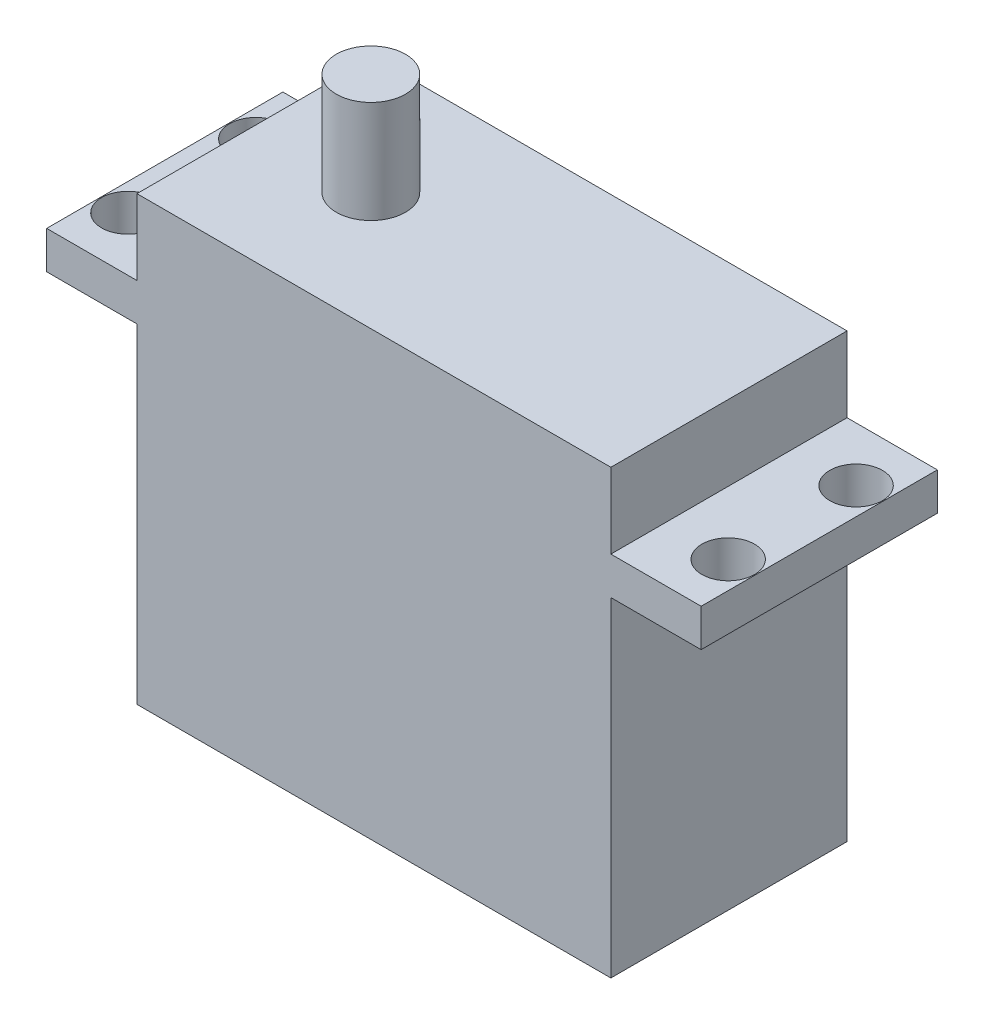
ISO-10303-21;
HEADER;
FILE_DESCRIPTION(('STEP AP214'),'2;1');
FILE_NAME('part.step','',(''),(''),'','','');
FILE_SCHEMA(('AUTOMOTIVE_DESIGN { 1 0 10303 214 1 1 1 1 }'));
ENDSEC;
DATA;
#1=APPLICATION_CONTEXT('core data for automotive mechanical design processes');
#2=APPLICATION_PROTOCOL_DEFINITION('international standard','automotive_design',2000,#1);
#3=PRODUCT_CONTEXT('',#1,'mechanical');
#4=PRODUCT('Part','Part','',(#3));
#5=PRODUCT_RELATED_PRODUCT_CATEGORY('part','',(#4));
#6=PRODUCT_DEFINITION_FORMATION('','',#4);
#7=PRODUCT_DEFINITION_CONTEXT('part definition',#1,'design');
#8=PRODUCT_DEFINITION('design','',#6,#7);
#9=PRODUCT_DEFINITION_SHAPE('','',#8);
#10=(LENGTH_UNIT() NAMED_UNIT(*) SI_UNIT(.MILLI.,.METRE.));
#11=(NAMED_UNIT(*) PLANE_ANGLE_UNIT() SI_UNIT($,.RADIAN.));
#12=(NAMED_UNIT(*) SI_UNIT($,.STERADIAN.) SOLID_ANGLE_UNIT());
#13=UNCERTAINTY_MEASURE_WITH_UNIT(LENGTH_MEASURE(1.E-05),#10,'distance_accuracy_value','');
#14=(GEOMETRIC_REPRESENTATION_CONTEXT(3) GLOBAL_UNCERTAINTY_ASSIGNED_CONTEXT((#13)) GLOBAL_UNIT_ASSIGNED_CONTEXT((#10,
#11,#12)) REPRESENTATION_CONTEXT('',''));
#15=CARTESIAN_POINT('',(0.,0.,0.));
#16=DIRECTION('',(0.,0.,1.));
#17=DIRECTION('',(1.,0.,0.));
#18=AXIS2_PLACEMENT_3D('',#15,#16,#17);
#19=CARTESIAN_POINT('',(0.,37.338,0.));
#20=DIRECTION('',(1.,0.,0.));
#21=DIRECTION('',(0.,0.,-1.));
#22=AXIS2_PLACEMENT_3D('',#19,#20,#21);
#23=PLANE('',#22);
#24=DIRECTION('',(0.,-1.,0.));
#25=VECTOR('',#24,1.);
#26=CARTESIAN_POINT('',(0.,37.338,0.));
#27=LINE('',#26,#25);
#28=CARTESIAN_POINT('',(0.,27.813,0.));
#29=VERTEX_POINT('',#28);
#30=CARTESIAN_POINT('',(0.,0.,0.));
#31=VERTEX_POINT('',#30);
#32=EDGE_CURVE('E272',#29,#31,#27,.T.);
#33=ORIENTED_EDGE('',*,*,#32,.F.);
#34=DIRECTION('',(0.,0.,-1.));
#35=VECTOR('',#34,1.);
#36=CARTESIAN_POINT('',(0.,27.813,0.));
#37=LINE('',#36,#35);
#38=CARTESIAN_POINT('',(0.,27.813,-19.939));
#39=VERTEX_POINT('',#38);
#40=EDGE_CURVE('E153',#29,#39,#37,.T.);
#41=ORIENTED_EDGE('',*,*,#40,.T.);
#42=DIRECTION('',(0.,-1.,0.));
#43=VECTOR('',#42,1.);
#44=CARTESIAN_POINT('',(0.,37.338,-19.939));
#45=LINE('',#44,#43);
#46=CARTESIAN_POINT('',(0.,0.,-19.939));
#47=VERTEX_POINT('',#46);
#48=EDGE_CURVE('E245',#39,#47,#45,.T.);
#49=ORIENTED_EDGE('',*,*,#48,.T.);
#50=DIRECTION('',(0.,0.,1.));
#51=VECTOR('',#50,1.);
#52=CARTESIAN_POINT('',(0.,0.,0.));
#53=LINE('',#52,#51);
#54=EDGE_CURVE('E230',#47,#31,#53,.T.);
#55=ORIENTED_EDGE('',*,*,#54,.T.);
#56=EDGE_LOOP('',(#33,#41,#49,#55));
#57=FACE_BOUND('',#56,.T.);
#58=ADVANCED_FACE('F43',(#57),#23,.F.);
#59=CARTESIAN_POINT('',(40.005,37.338,0.));
#60=DIRECTION('',(-1.,0.,0.));
#61=DIRECTION('',(0.,0.,1.));
#62=AXIS2_PLACEMENT_3D('',#59,#60,#61);
#63=PLANE('',#62);
#64=DIRECTION('',(0.,0.,1.));
#65=VECTOR('',#64,1.);
#66=CARTESIAN_POINT('',(40.005,30.988,0.));
#67=LINE('',#66,#65);
#68=CARTESIAN_POINT('',(40.005,30.988,-19.939));
#69=VERTEX_POINT('',#68);
#70=CARTESIAN_POINT('',(40.005,30.988,0.));
#71=VERTEX_POINT('',#70);
#72=EDGE_CURVE('E200',#69,#71,#67,.T.);
#73=ORIENTED_EDGE('',*,*,#72,.F.);
#74=DIRECTION('',(0.,-1.,0.));
#75=VECTOR('',#74,1.);
#76=CARTESIAN_POINT('',(40.005,37.338,-19.939));
#77=LINE('',#76,#75);
#78=CARTESIAN_POINT('',(40.005,37.338,-19.939));
#79=VERTEX_POINT('',#78);
#80=EDGE_CURVE('E264',#79,#69,#77,.T.);
#81=ORIENTED_EDGE('',*,*,#80,.F.);
#82=DIRECTION('',(0.,0.,-1.));
#83=VECTOR('',#82,1.);
#84=CARTESIAN_POINT('',(40.005,37.338,0.));
#85=LINE('',#84,#83);
#86=CARTESIAN_POINT('',(40.005,37.338,0.));
#87=VERTEX_POINT('',#86);
#88=EDGE_CURVE('E239',#87,#79,#85,.T.);
#89=ORIENTED_EDGE('',*,*,#88,.F.);
#90=DIRECTION('',(0.,-1.,0.));
#91=VECTOR('',#90,1.);
#92=CARTESIAN_POINT('',(40.005,37.338,0.));
#93=LINE('',#92,#91);
#94=EDGE_CURVE('E269',#87,#71,#93,.T.);
#95=ORIENTED_EDGE('',*,*,#94,.T.);
#96=EDGE_LOOP('',(#73,#81,#89,#95));
#97=FACE_BOUND('',#96,.T.);
#98=ADVANCED_FACE('F356',(#97),#63,.F.);
#99=DIRECTION('',(0.,0.,-1.));
#100=VECTOR('',#99,1.);
#101=CARTESIAN_POINT('',(40.005,27.813,0.));
#102=LINE('',#101,#100);
#103=CARTESIAN_POINT('',(40.005,27.813,0.));
#104=VERTEX_POINT('',#103);
#105=CARTESIAN_POINT('',(40.005,27.813,-19.939));
#106=VERTEX_POINT('',#105);
#107=EDGE_CURVE('E67',#104,#106,#102,.T.);
#108=ORIENTED_EDGE('',*,*,#107,.F.);
#109=CARTESIAN_POINT('',(40.005,0.,0.));
#110=VERTEX_POINT('',#109);
#111=EDGE_CURVE('E268',#104,#110,#93,.T.);
#112=ORIENTED_EDGE('',*,*,#111,.T.);
#113=DIRECTION('',(0.,0.,-1.));
#114=VECTOR('',#113,1.);
#115=CARTESIAN_POINT('',(40.005,0.,0.));
#116=LINE('',#115,#114);
#117=CARTESIAN_POINT('',(40.005,0.,-19.939));
#118=VERTEX_POINT('',#117);
#119=EDGE_CURVE('E252',#110,#118,#116,.T.);
#120=ORIENTED_EDGE('',*,*,#119,.T.);
#121=EDGE_CURVE('E263',#106,#118,#77,.T.);
#122=ORIENTED_EDGE('',*,*,#121,.F.);
#123=EDGE_LOOP('',(#108,#112,#120,#122));
#124=FACE_BOUND('',#123,.T.);
#125=ADVANCED_FACE('F340',(#124),#63,.F.);
#126=CARTESIAN_POINT('',(0.,37.338,-19.939));
#127=VERTEX_POINT('',#126);
#128=CARTESIAN_POINT('',(0.,30.988,-19.939));
#129=VERTEX_POINT('',#128);
#130=EDGE_CURVE('E259',#127,#129,#45,.T.);
#131=ORIENTED_EDGE('',*,*,#130,.T.);
#132=DIRECTION('',(0.,0.,1.));
#133=VECTOR('',#132,1.);
#134=CARTESIAN_POINT('',(0.,30.988,0.));
#135=LINE('',#134,#133);
#136=CARTESIAN_POINT('',(0.,30.988,0.));
#137=VERTEX_POINT('',#136);
#138=EDGE_CURVE('E166',#129,#137,#135,.T.);
#139=ORIENTED_EDGE('',*,*,#138,.T.);
#140=CARTESIAN_POINT('',(0.,37.338,0.));
#141=VERTEX_POINT('',#140);
#142=EDGE_CURVE('E52',#141,#137,#27,.T.);
#143=ORIENTED_EDGE('',*,*,#142,.F.);
#144=DIRECTION('',(0.,0.,1.));
#145=VECTOR('',#144,1.);
#146=CARTESIAN_POINT('',(0.,37.338,0.));
#147=LINE('',#146,#145);
#148=EDGE_CURVE('E231',#127,#141,#147,.T.);
#149=ORIENTED_EDGE('',*,*,#148,.F.);
#150=EDGE_LOOP('',(#131,#139,#143,#149));
#151=FACE_BOUND('',#150,.T.);
#152=ADVANCED_FACE('F45',(#151),#23,.F.);
#153=CARTESIAN_POINT('',(0.,37.338,0.));
#154=DIRECTION('',(0.,0.,-1.));
#155=DIRECTION('',(-1.,0.,0.));
#156=AXIS2_PLACEMENT_3D('',#153,#154,#155);
#157=PLANE('',#156);
#158=DIRECTION('',(1.,0.,0.));
#159=VECTOR('',#158,1.);
#160=CARTESIAN_POINT('',(0.,0.,0.));
#161=LINE('',#160,#159);
#162=EDGE_CURVE('E249',#31,#110,#161,.T.);
#163=ORIENTED_EDGE('',*,*,#162,.T.);
#164=ORIENTED_EDGE('',*,*,#111,.F.);
#165=DIRECTION('',(-1.,0.,0.));
#166=VECTOR('',#165,1.);
#167=CARTESIAN_POINT('',(47.625,27.813,0.));
#168=LINE('',#167,#166);
#169=CARTESIAN_POINT('',(47.625,27.813,0.));
#170=VERTEX_POINT('',#169);
#171=EDGE_CURVE('E226',#170,#104,#168,.T.);
#172=ORIENTED_EDGE('',*,*,#171,.F.);
#173=DIRECTION('',(0.,-1.,0.));
#174=VECTOR('',#173,1.);
#175=CARTESIAN_POINT('',(47.625,30.988,0.));
#176=LINE('',#175,#174);
#177=CARTESIAN_POINT('',(47.625,30.988,0.));
#178=VERTEX_POINT('',#177);
#179=EDGE_CURVE('E195',#178,#170,#176,.T.);
#180=ORIENTED_EDGE('',*,*,#179,.F.);
#181=DIRECTION('',(-1.,0.,0.));
#182=VECTOR('',#181,1.);
#183=CARTESIAN_POINT('',(47.625,30.988,0.));
#184=LINE('',#183,#182);
#185=EDGE_CURVE('E209',#178,#71,#184,.T.);
#186=ORIENTED_EDGE('',*,*,#185,.T.);
#187=ORIENTED_EDGE('',*,*,#94,.F.);
#188=DIRECTION('',(1.,0.,0.));
#189=VECTOR('',#188,1.);
#190=CARTESIAN_POINT('',(0.,37.338,0.));
#191=LINE('',#190,#189);
#192=EDGE_CURVE('E235',#141,#87,#191,.T.);
#193=ORIENTED_EDGE('',*,*,#192,.F.);
#194=ORIENTED_EDGE('',*,*,#142,.T.);
#195=DIRECTION('',(1.,0.,0.));
#196=VECTOR('',#195,1.);
#197=CARTESIAN_POINT('',(-7.62,30.988,0.));
#198=LINE('',#197,#196);
#199=CARTESIAN_POINT('',(-7.62,30.988,0.));
#200=VERTEX_POINT('',#199);
#201=EDGE_CURVE('E59',#200,#137,#198,.T.);
#202=ORIENTED_EDGE('',*,*,#201,.F.);
#203=DIRECTION('',(0.,-1.,0.));
#204=VECTOR('',#203,1.);
#205=CARTESIAN_POINT('',(-7.62,30.988,0.));
#206=LINE('',#205,#204);
#207=CARTESIAN_POINT('',(-7.62,27.813,0.));
#208=VERTEX_POINT('',#207);
#209=EDGE_CURVE('E137',#200,#208,#206,.T.);
#210=ORIENTED_EDGE('',*,*,#209,.T.);
#211=DIRECTION('',(1.,0.,0.));
#212=VECTOR('',#211,1.);
#213=CARTESIAN_POINT('',(-7.62,27.813,0.));
#214=LINE('',#213,#212);
#215=EDGE_CURVE('E165',#208,#29,#214,.T.);
#216=ORIENTED_EDGE('',*,*,#215,.T.);
#217=ORIENTED_EDGE('',*,*,#32,.T.);
#218=EDGE_LOOP('',(#163,#164,#172,#180,#186,#187,#193,#194,#202,#210,#216,#217));
#219=FACE_BOUND('',#218,.T.);
#220=ADVANCED_FACE('F136',(#219),#157,.F.);
#221=CARTESIAN_POINT('',(0.,37.338,-19.939));
#222=DIRECTION('',(0.,0.,1.));
#223=DIRECTION('',(1.,0.,0.));
#224=AXIS2_PLACEMENT_3D('',#221,#222,#223);
#225=PLANE('',#224);
#226=DIRECTION('',(-1.,0.,0.));
#227=VECTOR('',#226,1.);
#228=CARTESIAN_POINT('',(0.,0.,-19.939));
#229=LINE('',#228,#227);
#230=EDGE_CURVE('E236',#118,#47,#229,.T.);
#231=ORIENTED_EDGE('',*,*,#230,.T.);
#232=ORIENTED_EDGE('',*,*,#48,.F.);
#233=DIRECTION('',(1.,0.,0.));
#234=VECTOR('',#233,1.);
#235=CARTESIAN_POINT('',(-7.62,27.813,-19.939));
#236=LINE('',#235,#234);
#237=CARTESIAN_POINT('',(-7.62,27.813,-19.939));
#238=VERTEX_POINT('',#237);
#239=EDGE_CURVE('E175',#238,#39,#236,.T.);
#240=ORIENTED_EDGE('',*,*,#239,.F.);
#241=DIRECTION('',(0.,1.,0.));
#242=VECTOR('',#241,1.);
#243=CARTESIAN_POINT('',(-7.62,30.988,-19.939));
#244=LINE('',#243,#242);
#245=CARTESIAN_POINT('',(-7.62,30.988,-19.939));
#246=VERTEX_POINT('',#245);
#247=EDGE_CURVE('E157',#238,#246,#244,.T.);
#248=ORIENTED_EDGE('',*,*,#247,.T.);
#249=DIRECTION('',(1.,0.,0.));
#250=VECTOR('',#249,1.);
#251=CARTESIAN_POINT('',(-7.62,30.988,-19.939));
#252=LINE('',#251,#250);
#253=EDGE_CURVE('E142',#246,#129,#252,.T.);
#254=ORIENTED_EDGE('',*,*,#253,.T.);
#255=ORIENTED_EDGE('',*,*,#130,.F.);
#256=DIRECTION('',(-1.,0.,0.));
#257=VECTOR('',#256,1.);
#258=CARTESIAN_POINT('',(0.,37.338,-19.939));
#259=LINE('',#258,#257);
#260=EDGE_CURVE('E242',#79,#127,#259,.T.);
#261=ORIENTED_EDGE('',*,*,#260,.F.);
#262=ORIENTED_EDGE('',*,*,#80,.T.);
#263=DIRECTION('',(-1.,0.,0.));
#264=VECTOR('',#263,1.);
#265=CARTESIAN_POINT('',(47.625,30.988,-19.939));
#266=LINE('',#265,#264);
#267=CARTESIAN_POINT('',(47.625,30.988,-19.939));
#268=VERTEX_POINT('',#267);
#269=EDGE_CURVE('E218',#268,#69,#266,.T.);
#270=ORIENTED_EDGE('',*,*,#269,.F.);
#271=DIRECTION('',(0.,1.,0.));
#272=VECTOR('',#271,1.);
#273=CARTESIAN_POINT('',(47.625,30.988,-19.939));
#274=LINE('',#273,#272);
#275=CARTESIAN_POINT('',(47.625,27.813,-19.939));
#276=VERTEX_POINT('',#275);
#277=EDGE_CURVE('E203',#276,#268,#274,.T.);
#278=ORIENTED_EDGE('',*,*,#277,.F.);
#279=DIRECTION('',(-1.,0.,0.));
#280=VECTOR('',#279,1.);
#281=CARTESIAN_POINT('',(47.625,27.813,-19.939));
#282=LINE('',#281,#280);
#283=EDGE_CURVE('E222',#276,#106,#282,.T.);
#284=ORIENTED_EDGE('',*,*,#283,.T.);
#285=ORIENTED_EDGE('',*,*,#121,.T.);
#286=EDGE_LOOP('',(#231,#232,#240,#248,#254,#255,#261,#262,#270,#278,#284,#285));
#287=FACE_BOUND('',#286,.T.);
#288=ADVANCED_FACE('F317',(#287),#225,.F.);
#289=CARTESIAN_POINT('',(0.,37.338,0.));
#290=DIRECTION('',(0.,-1.,0.));
#291=DIRECTION('',(0.,0.,-1.));
#292=AXIS2_PLACEMENT_3D('',#289,#290,#291);
#293=PLANE('',#292);
#294=CARTESIAN_POINT('',(9.779,37.338,-9.9695));
#295=DIRECTION('',(0.,-1.,0.));
#296=DIRECTION('',(0.,0.,-1.));
#297=AXIS2_PLACEMENT_3D('',#294,#295,#296);
#298=CIRCLE('',#297,2.921);
#299=CARTESIAN_POINT('',(9.779,37.338,-12.8905));
#300=VERTEX_POINT('',#299);
#301=EDGE_CURVE('E11',#300,#300,#298,.F.);
#302=ORIENTED_EDGE('',*,*,#301,.F.);
#303=EDGE_LOOP('',(#302));
#304=FACE_BOUND('',#303,.T.);
#305=ORIENTED_EDGE('',*,*,#148,.T.);
#306=ORIENTED_EDGE('',*,*,#192,.T.);
#307=ORIENTED_EDGE('',*,*,#88,.T.);
#308=ORIENTED_EDGE('',*,*,#260,.T.);
#309=EDGE_LOOP('',(#305,#306,#307,#308));
#310=FACE_BOUND('',#309,.T.);
#311=ADVANCED_FACE('F313',(#304,#310),#293,.F.);
#312=CARTESIAN_POINT('',(0.,0.,0.));
#313=DIRECTION('',(0.,-1.,0.));
#314=DIRECTION('',(0.,0.,-1.));
#315=AXIS2_PLACEMENT_3D('',#312,#313,#314);
#316=PLANE('',#315);
#317=ORIENTED_EDGE('',*,*,#54,.F.);
#318=ORIENTED_EDGE('',*,*,#230,.F.);
#319=ORIENTED_EDGE('',*,*,#119,.F.);
#320=ORIENTED_EDGE('',*,*,#162,.F.);
#321=EDGE_LOOP('',(#317,#318,#319,#320));
#322=FACE_BOUND('',#321,.T.);
#323=ADVANCED_FACE('F316',(#322),#316,.T.);
#324=CARTESIAN_POINT('',(47.625,27.813,0.));
#325=DIRECTION('',(0.,1.,0.));
#326=DIRECTION('',(0.,0.,1.));
#327=AXIS2_PLACEMENT_3D('',#324,#325,#326);
#328=PLANE('',#327);
#329=CARTESIAN_POINT('',(45.339,27.813,-15.367));
#330=DIRECTION('',(0.,1.,0.));
#331=DIRECTION('',(0.,0.,1.));
#332=AXIS2_PLACEMENT_3D('',#329,#330,#331);
#333=CIRCLE('',#332,2.2225);
#334=CARTESIAN_POINT('',(45.339,27.813,-13.1445));
#335=VERTEX_POINT('',#334);
#336=EDGE_CURVE('E191',#335,#335,#333,.T.);
#337=ORIENTED_EDGE('',*,*,#336,.T.);
#338=EDGE_LOOP('',(#337));
#339=FACE_BOUND('',#338,.T.);
#340=CARTESIAN_POINT('',(45.339,27.813,-4.572));
#341=DIRECTION('',(0.,1.,0.));
#342=DIRECTION('',(0.,0.,1.));
#343=AXIS2_PLACEMENT_3D('',#340,#341,#342);
#344=CIRCLE('',#343,2.2225);
#345=CARTESIAN_POINT('',(45.339,27.813,-2.3495));
#346=VERTEX_POINT('',#345);
#347=EDGE_CURVE('E184',#346,#346,#344,.T.);
#348=ORIENTED_EDGE('',*,*,#347,.T.);
#349=EDGE_LOOP('',(#348));
#350=FACE_BOUND('',#349,.T.);
#351=ORIENTED_EDGE('',*,*,#107,.T.);
#352=ORIENTED_EDGE('',*,*,#283,.F.);
#353=DIRECTION('',(0.,0.,-1.));
#354=VECTOR('',#353,1.);
#355=CARTESIAN_POINT('',(47.625,27.813,0.));
#356=LINE('',#355,#354);
#357=EDGE_CURVE('E199',#170,#276,#356,.T.);
#358=ORIENTED_EDGE('',*,*,#357,.F.);
#359=ORIENTED_EDGE('',*,*,#171,.T.);
#360=EDGE_LOOP('',(#351,#352,#358,#359));
#361=FACE_BOUND('',#360,.T.);
#362=ADVANCED_FACE('F345',(#339,#350,#361),#328,.F.);
#363=CARTESIAN_POINT('',(47.625,30.988,0.));
#364=DIRECTION('',(0.,-1.,0.));
#365=DIRECTION('',(0.,0.,-1.));
#366=AXIS2_PLACEMENT_3D('',#363,#364,#365);
#367=PLANE('',#366);
#368=CARTESIAN_POINT('',(45.339,30.988,-15.367));
#369=DIRECTION('',(0.,1.,0.));
#370=DIRECTION('',(0.,0.,1.));
#371=AXIS2_PLACEMENT_3D('',#368,#369,#370);
#372=CIRCLE('',#371,2.2225);
#373=CARTESIAN_POINT('',(45.339,30.988,-13.1445));
#374=VERTEX_POINT('',#373);
#375=EDGE_CURVE('E180',#374,#374,#372,.T.);
#376=ORIENTED_EDGE('',*,*,#375,.F.);
#377=EDGE_LOOP('',(#376));
#378=FACE_BOUND('',#377,.T.);
#379=CARTESIAN_POINT('',(45.339,30.988,-4.572));
#380=DIRECTION('',(0.,1.,0.));
#381=DIRECTION('',(0.,0.,1.));
#382=AXIS2_PLACEMENT_3D('',#379,#380,#381);
#383=CIRCLE('',#382,2.2225);
#384=CARTESIAN_POINT('',(45.339,30.988,-2.3495));
#385=VERTEX_POINT('',#384);
#386=EDGE_CURVE('E141',#385,#385,#383,.T.);
#387=ORIENTED_EDGE('',*,*,#386,.F.);
#388=EDGE_LOOP('',(#387));
#389=FACE_BOUND('',#388,.T.);
#390=ORIENTED_EDGE('',*,*,#72,.T.);
#391=ORIENTED_EDGE('',*,*,#185,.F.);
#392=DIRECTION('',(0.,0.,1.));
#393=VECTOR('',#392,1.);
#394=CARTESIAN_POINT('',(47.625,30.988,0.));
#395=LINE('',#394,#393);
#396=EDGE_CURVE('E206',#268,#178,#395,.T.);
#397=ORIENTED_EDGE('',*,*,#396,.F.);
#398=ORIENTED_EDGE('',*,*,#269,.T.);
#399=EDGE_LOOP('',(#390,#391,#397,#398));
#400=FACE_BOUND('',#399,.T.);
#401=ADVANCED_FACE('F352',(#378,#389,#400),#367,.F.);
#402=CARTESIAN_POINT('',(47.625,0.,0.));
#403=DIRECTION('',(1.,0.,0.));
#404=DIRECTION('',(0.,0.,-1.));
#405=AXIS2_PLACEMENT_3D('',#402,#403,#404);
#406=PLANE('',#405);
#407=ORIENTED_EDGE('',*,*,#179,.T.);
#408=ORIENTED_EDGE('',*,*,#357,.T.);
#409=ORIENTED_EDGE('',*,*,#277,.T.);
#410=ORIENTED_EDGE('',*,*,#396,.T.);
#411=EDGE_LOOP('',(#407,#408,#409,#410));
#412=FACE_BOUND('',#411,.T.);
#413=ADVANCED_FACE('F347',(#412),#406,.T.);
#414=CARTESIAN_POINT('',(45.339,0.,-4.572));
#415=DIRECTION('',(0.,1.,0.));
#416=DIRECTION('',(0.,0.,1.));
#417=AXIS2_PLACEMENT_3D('',#414,#415,#416);
#418=CYLINDRICAL_SURFACE('',#417,2.2225);
#419=CARTESIAN_POINT('',(45.339,30.988,-2.3495));
#420=CARTESIAN_POINT('',(45.339,30.9549270833333,-2.3495));
#421=CARTESIAN_POINT('',(45.339,30.9218541666667,-2.3495));
#422=CARTESIAN_POINT('',(45.339,30.8557083333333,-2.3495));
#423=CARTESIAN_POINT('',(45.339,30.8226354166667,-2.3495));
#424=CARTESIAN_POINT('',(45.339,30.7564895833333,-2.3495));
#425=CARTESIAN_POINT('',(45.339,30.7234166666667,-2.3495));
#426=CARTESIAN_POINT('',(45.339,30.6572708333333,-2.3495));
#427=CARTESIAN_POINT('',(45.339,30.6241979166667,-2.3495));
#428=CARTESIAN_POINT('',(45.339,30.5580520833333,-2.3495));
#429=CARTESIAN_POINT('',(45.339,30.5249791666667,-2.3495));
#430=CARTESIAN_POINT('',(45.339,30.4588333333333,-2.3495));
#431=CARTESIAN_POINT('',(45.339,30.4257604166667,-2.3495));
#432=CARTESIAN_POINT('',(45.339,30.3596145833333,-2.3495));
#433=CARTESIAN_POINT('',(45.339,30.3265416666667,-2.3495));
#434=CARTESIAN_POINT('',(45.339,30.2603958333333,-2.3495));
#435=CARTESIAN_POINT('',(45.339,30.2273229166667,-2.3495));
#436=CARTESIAN_POINT('',(45.339,30.1611770833333,-2.3495));
#437=CARTESIAN_POINT('',(45.339,30.1281041666667,-2.3495));
#438=CARTESIAN_POINT('',(45.339,30.0619583333333,-2.3495));
#439=CARTESIAN_POINT('',(45.339,30.0288854166667,-2.3495));
#440=CARTESIAN_POINT('',(45.339,29.9627395833333,-2.3495));
#441=CARTESIAN_POINT('',(45.339,29.9296666666667,-2.3495));
#442=CARTESIAN_POINT('',(45.339,29.8635208333333,-2.3495));
#443=CARTESIAN_POINT('',(45.339,29.8304479166667,-2.3495));
#444=CARTESIAN_POINT('',(45.339,29.7643020833333,-2.3495));
#445=CARTESIAN_POINT('',(45.339,29.7312291666667,-2.3495));
#446=CARTESIAN_POINT('',(45.339,29.6650833333333,-2.3495));
#447=CARTESIAN_POINT('',(45.339,29.6320104166667,-2.3495));
#448=CARTESIAN_POINT('',(45.339,29.5658645833333,-2.3495));
#449=CARTESIAN_POINT('',(45.339,29.5327916666667,-2.3495));
#450=CARTESIAN_POINT('',(45.339,29.4666458333333,-2.3495));
#451=CARTESIAN_POINT('',(45.339,29.4335729166667,-2.3495));
#452=CARTESIAN_POINT('',(45.339,29.3674270833333,-2.3495));
#453=CARTESIAN_POINT('',(45.339,29.3343541666667,-2.3495));
#454=CARTESIAN_POINT('',(45.339,29.2682083333333,-2.3495));
#455=CARTESIAN_POINT('',(45.339,29.2351354166667,-2.3495));
#456=CARTESIAN_POINT('',(45.339,29.1689895833333,-2.3495));
#457=CARTESIAN_POINT('',(45.339,29.1359166666667,-2.3495));
#458=CARTESIAN_POINT('',(45.339,29.0697708333333,-2.3495));
#459=CARTESIAN_POINT('',(45.339,29.0366979166667,-2.3495));
#460=CARTESIAN_POINT('',(45.339,28.9705520833333,-2.3495));
#461=CARTESIAN_POINT('',(45.339,28.9374791666667,-2.3495));
#462=CARTESIAN_POINT('',(45.339,28.8713333333333,-2.3495));
#463=CARTESIAN_POINT('',(45.339,28.8382604166667,-2.3495));
#464=CARTESIAN_POINT('',(45.339,28.7721145833333,-2.3495));
#465=CARTESIAN_POINT('',(45.339,28.7390416666667,-2.3495));
#466=CARTESIAN_POINT('',(45.339,28.6728958333333,-2.3495));
#467=CARTESIAN_POINT('',(45.339,28.6398229166667,-2.3495));
#468=CARTESIAN_POINT('',(45.339,28.5736770833333,-2.3495));
#469=CARTESIAN_POINT('',(45.339,28.5406041666667,-2.3495));
#470=CARTESIAN_POINT('',(45.339,28.4744583333333,-2.3495));
#471=CARTESIAN_POINT('',(45.339,28.4413854166667,-2.3495));
#472=CARTESIAN_POINT('',(45.339,28.3752395833333,-2.3495));
#473=CARTESIAN_POINT('',(45.339,28.3421666666667,-2.3495));
#474=CARTESIAN_POINT('',(45.339,28.2760208333333,-2.3495));
#475=CARTESIAN_POINT('',(45.339,28.2429479166667,-2.3495));
#476=CARTESIAN_POINT('',(45.339,28.1768020833333,-2.3495));
#477=CARTESIAN_POINT('',(45.339,28.1437291666667,-2.3495));
#478=CARTESIAN_POINT('',(45.339,28.0775833333333,-2.3495));
#479=CARTESIAN_POINT('',(45.339,28.0445104166667,-2.3495));
#480=CARTESIAN_POINT('',(45.339,27.9783645833333,-2.3495));
#481=CARTESIAN_POINT('',(45.339,27.9452916666667,-2.3495));
#482=CARTESIAN_POINT('',(45.339,27.8791458333333,-2.3495));
#483=CARTESIAN_POINT('',(45.339,27.8460729166667,-2.3495));
#484=CARTESIAN_POINT('',(45.339,27.813,-2.3495));
#485=B_SPLINE_CURVE_WITH_KNOTS('',3,(#419,#420,#421,#422,#423,#424,#425,#426,#427,#428,#429,
#430,#431,#432,#433,#434,#435,#436,#437,#438,#439,#440,#441,#442,#443,#444,#445,#446,#447,#448,
#449,#450,#451,#452,#453,#454,#455,#456,#457,#458,#459,#460,#461,#462,#463,#464,#465,#466,#467,
#468,#469,#470,#471,#472,#473,#474,#475,#476,#477,#478,#479,#480,#481,#482,#483,#484),
.UNSPECIFIED.,.F.,.F.,(4,2,2,2,2,2,2,2,2,2,2,2,2,2,2,2,2,2,2,2,2,2,2,2,2,2,2,2,2,2,2,2,4),(0.,
0.0992187500000012,0.198437499999999,0.29765625,0.396875000000001,0.496093749999999,0.5953125,
0.694531250000002,0.793750000000003,0.892968750000001,0.992187500000002,1.09140625,1.190625,
1.28984375,1.3890625,1.48828125,1.5875,1.68671875,1.7859375,1.88515625,1.984375,2.08359375,
2.1828125,2.28203125,2.38125,2.48046875,2.5796875,2.67890625,2.778125,2.87734375,
2.97656250000001,3.07578125,3.175),.UNSPECIFIED.);
#486=EDGE_CURVE('BSEAM390',#385,#346,#485,.T.);
#487=ORIENTED_EDGE('',*,*,#386,.T.);
#488=ORIENTED_EDGE('',*,*,#347,.F.);
#489=ORIENTED_EDGE('',*,*,#486,.T.);
#490=ORIENTED_EDGE('',*,*,#486,.F.);
#491=EDGE_LOOP('',(#487,#489,#488,#490));
#492=FACE_BOUND('',#491,.T.);
#493=ADVANCED_FACE('F390',(#492),#418,.F.);
#494=CARTESIAN_POINT('',(45.339,0.,-15.367));
#495=DIRECTION('',(0.,1.,0.));
#496=DIRECTION('',(0.,0.,1.));
#497=AXIS2_PLACEMENT_3D('',#494,#495,#496);
#498=CYLINDRICAL_SURFACE('',#497,2.2225);
#499=CARTESIAN_POINT('',(45.339,30.988,-13.1445));
#500=CARTESIAN_POINT('',(45.339,30.9549270833333,-13.1445));
#501=CARTESIAN_POINT('',(45.339,30.9218541666667,-13.1445));
#502=CARTESIAN_POINT('',(45.339,30.8557083333333,-13.1445));
#503=CARTESIAN_POINT('',(45.339,30.8226354166667,-13.1445));
#504=CARTESIAN_POINT('',(45.339,30.7564895833333,-13.1445));
#505=CARTESIAN_POINT('',(45.339,30.7234166666667,-13.1445));
#506=CARTESIAN_POINT('',(45.339,30.6572708333333,-13.1445));
#507=CARTESIAN_POINT('',(45.339,30.6241979166667,-13.1445));
#508=CARTESIAN_POINT('',(45.339,30.5580520833333,-13.1445));
#509=CARTESIAN_POINT('',(45.339,30.5249791666667,-13.1445));
#510=CARTESIAN_POINT('',(45.339,30.4588333333333,-13.1445));
#511=CARTESIAN_POINT('',(45.339,30.4257604166667,-13.1445));
#512=CARTESIAN_POINT('',(45.339,30.3596145833333,-13.1445));
#513=CARTESIAN_POINT('',(45.339,30.3265416666667,-13.1445));
#514=CARTESIAN_POINT('',(45.339,30.2603958333333,-13.1445));
#515=CARTESIAN_POINT('',(45.339,30.2273229166667,-13.1445));
#516=CARTESIAN_POINT('',(45.339,30.1611770833333,-13.1445));
#517=CARTESIAN_POINT('',(45.339,30.1281041666667,-13.1445));
#518=CARTESIAN_POINT('',(45.339,30.0619583333333,-13.1445));
#519=CARTESIAN_POINT('',(45.339,30.0288854166667,-13.1445));
#520=CARTESIAN_POINT('',(45.339,29.9627395833333,-13.1445));
#521=CARTESIAN_POINT('',(45.339,29.9296666666667,-13.1445));
#522=CARTESIAN_POINT('',(45.339,29.8635208333333,-13.1445));
#523=CARTESIAN_POINT('',(45.339,29.8304479166667,-13.1445));
#524=CARTESIAN_POINT('',(45.339,29.7643020833333,-13.1445));
#525=CARTESIAN_POINT('',(45.339,29.7312291666667,-13.1445));
#526=CARTESIAN_POINT('',(45.339,29.6650833333333,-13.1445));
#527=CARTESIAN_POINT('',(45.339,29.6320104166667,-13.1445));
#528=CARTESIAN_POINT('',(45.339,29.5658645833333,-13.1445));
#529=CARTESIAN_POINT('',(45.339,29.5327916666667,-13.1445));
#530=CARTESIAN_POINT('',(45.339,29.4666458333333,-13.1445));
#531=CARTESIAN_POINT('',(45.339,29.4335729166667,-13.1445));
#532=CARTESIAN_POINT('',(45.339,29.3674270833333,-13.1445));
#533=CARTESIAN_POINT('',(45.339,29.3343541666667,-13.1445));
#534=CARTESIAN_POINT('',(45.339,29.2682083333333,-13.1445));
#535=CARTESIAN_POINT('',(45.339,29.2351354166667,-13.1445));
#536=CARTESIAN_POINT('',(45.339,29.1689895833333,-13.1445));
#537=CARTESIAN_POINT('',(45.339,29.1359166666667,-13.1445));
#538=CARTESIAN_POINT('',(45.339,29.0697708333333,-13.1445));
#539=CARTESIAN_POINT('',(45.339,29.0366979166667,-13.1445));
#540=CARTESIAN_POINT('',(45.339,28.9705520833333,-13.1445));
#541=CARTESIAN_POINT('',(45.339,28.9374791666667,-13.1445));
#542=CARTESIAN_POINT('',(45.339,28.8713333333333,-13.1445));
#543=CARTESIAN_POINT('',(45.339,28.8382604166667,-13.1445));
#544=CARTESIAN_POINT('',(45.339,28.7721145833333,-13.1445));
#545=CARTESIAN_POINT('',(45.339,28.7390416666667,-13.1445));
#546=CARTESIAN_POINT('',(45.339,28.6728958333333,-13.1445));
#547=CARTESIAN_POINT('',(45.339,28.6398229166667,-13.1445));
#548=CARTESIAN_POINT('',(45.339,28.5736770833333,-13.1445));
#549=CARTESIAN_POINT('',(45.339,28.5406041666667,-13.1445));
#550=CARTESIAN_POINT('',(45.339,28.4744583333333,-13.1445));
#551=CARTESIAN_POINT('',(45.339,28.4413854166667,-13.1445));
#552=CARTESIAN_POINT('',(45.339,28.3752395833333,-13.1445));
#553=CARTESIAN_POINT('',(45.339,28.3421666666667,-13.1445));
#554=CARTESIAN_POINT('',(45.339,28.2760208333333,-13.1445));
#555=CARTESIAN_POINT('',(45.339,28.2429479166667,-13.1445));
#556=CARTESIAN_POINT('',(45.339,28.1768020833333,-13.1445));
#557=CARTESIAN_POINT('',(45.339,28.1437291666667,-13.1445));
#558=CARTESIAN_POINT('',(45.339,28.0775833333333,-13.1445));
#559=CARTESIAN_POINT('',(45.339,28.0445104166667,-13.1445));
#560=CARTESIAN_POINT('',(45.339,27.9783645833333,-13.1445));
#561=CARTESIAN_POINT('',(45.339,27.9452916666667,-13.1445));
#562=CARTESIAN_POINT('',(45.339,27.8791458333333,-13.1445));
#563=CARTESIAN_POINT('',(45.339,27.8460729166667,-13.1445));
#564=CARTESIAN_POINT('',(45.339,27.813,-13.1445));
#565=B_SPLINE_CURVE_WITH_KNOTS('',3,(#499,#500,#501,#502,#503,#504,#505,#506,#507,#508,#509,
#510,#511,#512,#513,#514,#515,#516,#517,#518,#519,#520,#521,#522,#523,#524,#525,#526,#527,#528,
#529,#530,#531,#532,#533,#534,#535,#536,#537,#538,#539,#540,#541,#542,#543,#544,#545,#546,#547,
#548,#549,#550,#551,#552,#553,#554,#555,#556,#557,#558,#559,#560,#561,#562,#563,#564),
.UNSPECIFIED.,.F.,.F.,(4,2,2,2,2,2,2,2,2,2,2,2,2,2,2,2,2,2,2,2,2,2,2,2,2,2,2,2,2,2,2,2,4),(0.,
0.0992187500000012,0.198437499999999,0.29765625,0.396875000000001,0.496093749999999,0.5953125,
0.694531250000002,0.793750000000003,0.892968750000001,0.992187500000002,1.09140625,1.190625,
1.28984375,1.3890625,1.48828125,1.5875,1.68671875,1.7859375,1.88515625,1.984375,2.08359375,
2.1828125,2.28203125,2.38125,2.48046875,2.5796875,2.67890625,2.778125,2.87734375,
2.97656250000001,3.07578125,3.175),.UNSPECIFIED.);
#566=EDGE_CURVE('BSEAM422',#374,#335,#565,.T.);
#567=ORIENTED_EDGE('',*,*,#375,.T.);
#568=ORIENTED_EDGE('',*,*,#336,.F.);
#569=ORIENTED_EDGE('',*,*,#566,.T.);
#570=ORIENTED_EDGE('',*,*,#566,.F.);
#571=EDGE_LOOP('',(#567,#569,#568,#570));
#572=FACE_BOUND('',#571,.T.);
#573=ADVANCED_FACE('F422',(#572),#498,.F.);
#574=CARTESIAN_POINT('',(-7.62,30.988,0.));
#575=DIRECTION('',(0.,1.,0.));
#576=DIRECTION('',(0.,0.,1.));
#577=AXIS2_PLACEMENT_3D('',#574,#575,#576);
#578=PLANE('',#577);
#579=CARTESIAN_POINT('',(-5.334,30.988,-15.367));
#580=DIRECTION('',(0.,-1.,0.));
#581=DIRECTION('',(0.,0.,1.));
#582=AXIS2_PLACEMENT_3D('',#579,#580,#581);
#583=CIRCLE('',#582,2.2225);
#584=CARTESIAN_POINT('',(-5.334,30.988,-13.1445));
#585=VERTEX_POINT('',#584);
#586=EDGE_CURVE('E278',#585,#585,#583,.T.);
#587=ORIENTED_EDGE('',*,*,#586,.T.);
#588=EDGE_LOOP('',(#587));
#589=FACE_BOUND('',#588,.T.);
#590=CARTESIAN_POINT('',(-5.334,30.988,-4.572));
#591=DIRECTION('',(0.,-1.,0.));
#592=DIRECTION('',(0.,0.,1.));
#593=AXIS2_PLACEMENT_3D('',#590,#591,#592);
#594=CIRCLE('',#593,2.2225);
#595=CARTESIAN_POINT('',(-5.334,30.988,-2.3495));
#596=VERTEX_POINT('',#595);
#597=EDGE_CURVE('E296',#596,#596,#594,.T.);
#598=ORIENTED_EDGE('',*,*,#597,.T.);
#599=EDGE_LOOP('',(#598));
#600=FACE_BOUND('',#599,.T.);
#601=ORIENTED_EDGE('',*,*,#138,.F.);
#602=ORIENTED_EDGE('',*,*,#253,.F.);
#603=DIRECTION('',(0.,0.,1.));
#604=VECTOR('',#603,1.);
#605=CARTESIAN_POINT('',(-7.62,30.988,0.));
#606=LINE('',#605,#604);
#607=EDGE_CURVE('E148',#246,#200,#606,.T.);
#608=ORIENTED_EDGE('',*,*,#607,.T.);
#609=ORIENTED_EDGE('',*,*,#201,.T.);
#610=EDGE_LOOP('',(#601,#602,#608,#609));
#611=FACE_BOUND('',#610,.T.);
#612=ADVANCED_FACE('F155',(#589,#600,#611),#578,.T.);
#613=CARTESIAN_POINT('',(-7.62,27.813,0.));
#614=DIRECTION('',(0.,-1.,0.));
#615=DIRECTION('',(0.,0.,-1.));
#616=AXIS2_PLACEMENT_3D('',#613,#614,#615);
#617=PLANE('',#616);
#618=CARTESIAN_POINT('',(-5.334,27.813,-15.367));
#619=DIRECTION('',(0.,-1.,0.));
#620=DIRECTION('',(0.,0.,-1.));
#621=AXIS2_PLACEMENT_3D('',#618,#619,#620);
#622=CIRCLE('',#621,2.2225);
#623=CARTESIAN_POINT('',(-5.334,27.813,-13.1445));
#624=VERTEX_POINT('',#623);
#625=EDGE_CURVE('E169',#624,#624,#622,.F.);
#626=ORIENTED_EDGE('',*,*,#625,.T.);
#627=EDGE_LOOP('',(#626));
#628=FACE_BOUND('',#627,.T.);
#629=CARTESIAN_POINT('',(-5.334,27.813,-4.572));
#630=DIRECTION('',(0.,-1.,0.));
#631=DIRECTION('',(0.,0.,-1.));
#632=AXIS2_PLACEMENT_3D('',#629,#630,#631);
#633=CIRCLE('',#632,2.2225);
#634=CARTESIAN_POINT('',(-5.334,27.813,-2.3495));
#635=VERTEX_POINT('',#634);
#636=EDGE_CURVE('E275',#635,#635,#633,.F.);
#637=ORIENTED_EDGE('',*,*,#636,.T.);
#638=EDGE_LOOP('',(#637));
#639=FACE_BOUND('',#638,.T.);
#640=ORIENTED_EDGE('',*,*,#40,.F.);
#641=ORIENTED_EDGE('',*,*,#215,.F.);
#642=DIRECTION('',(0.,0.,-1.));
#643=VECTOR('',#642,1.);
#644=CARTESIAN_POINT('',(-7.62,27.813,0.));
#645=LINE('',#644,#643);
#646=EDGE_CURVE('E151',#208,#238,#645,.T.);
#647=ORIENTED_EDGE('',*,*,#646,.T.);
#648=ORIENTED_EDGE('',*,*,#239,.T.);
#649=EDGE_LOOP('',(#640,#641,#647,#648));
#650=FACE_BOUND('',#649,.T.);
#651=ADVANCED_FACE('F283',(#628,#639,#650),#617,.T.);
#652=CARTESIAN_POINT('',(-7.62,0.,0.));
#653=DIRECTION('',(-1.,0.,0.));
#654=DIRECTION('',(0.,0.,-1.));
#655=AXIS2_PLACEMENT_3D('',#652,#653,#654);
#656=PLANE('',#655);
#657=ORIENTED_EDGE('',*,*,#209,.F.);
#658=ORIENTED_EDGE('',*,*,#607,.F.);
#659=ORIENTED_EDGE('',*,*,#247,.F.);
#660=ORIENTED_EDGE('',*,*,#646,.F.);
#661=EDGE_LOOP('',(#657,#658,#659,#660));
#662=FACE_BOUND('',#661,.T.);
#663=ADVANCED_FACE('F146',(#662),#656,.T.);
#664=CARTESIAN_POINT('',(-5.334,0.,-4.572));
#665=DIRECTION('',(0.,1.,0.));
#666=DIRECTION('',(0.,0.,1.));
#667=AXIS2_PLACEMENT_3D('',#664,#665,#666);
#668=CYLINDRICAL_SURFACE('',#667,2.2225);
#669=CARTESIAN_POINT('',(-5.334,27.813,-2.3495));
#670=CARTESIAN_POINT('',(-5.334,27.8460729166667,-2.3495));
#671=CARTESIAN_POINT('',(-5.334,27.8791458333333,-2.3495));
#672=CARTESIAN_POINT('',(-5.334,27.9452916666667,-2.3495));
#673=CARTESIAN_POINT('',(-5.334,27.9783645833333,-2.3495));
#674=CARTESIAN_POINT('',(-5.334,28.0445104166667,-2.3495));
#675=CARTESIAN_POINT('',(-5.334,28.0775833333333,-2.3495));
#676=CARTESIAN_POINT('',(-5.334,28.1437291666667,-2.3495));
#677=CARTESIAN_POINT('',(-5.334,28.1768020833333,-2.3495));
#678=CARTESIAN_POINT('',(-5.334,28.2429479166667,-2.3495));
#679=CARTESIAN_POINT('',(-5.334,28.2760208333333,-2.3495));
#680=CARTESIAN_POINT('',(-5.334,28.3421666666667,-2.3495));
#681=CARTESIAN_POINT('',(-5.334,28.3752395833333,-2.3495));
#682=CARTESIAN_POINT('',(-5.334,28.4413854166667,-2.3495));
#683=CARTESIAN_POINT('',(-5.334,28.4744583333333,-2.3495));
#684=CARTESIAN_POINT('',(-5.334,28.5406041666667,-2.3495));
#685=CARTESIAN_POINT('',(-5.334,28.5736770833333,-2.3495));
#686=CARTESIAN_POINT('',(-5.334,28.6398229166667,-2.3495));
#687=CARTESIAN_POINT('',(-5.334,28.6728958333333,-2.3495));
#688=CARTESIAN_POINT('',(-5.334,28.7390416666667,-2.3495));
#689=CARTESIAN_POINT('',(-5.334,28.7721145833333,-2.3495));
#690=CARTESIAN_POINT('',(-5.334,28.8382604166667,-2.3495));
#691=CARTESIAN_POINT('',(-5.334,28.8713333333333,-2.3495));
#692=CARTESIAN_POINT('',(-5.334,28.9374791666667,-2.3495));
#693=CARTESIAN_POINT('',(-5.334,28.9705520833333,-2.3495));
#694=CARTESIAN_POINT('',(-5.334,29.0366979166667,-2.3495));
#695=CARTESIAN_POINT('',(-5.334,29.0697708333333,-2.3495));
#696=CARTESIAN_POINT('',(-5.334,29.1359166666667,-2.3495));
#697=CARTESIAN_POINT('',(-5.334,29.1689895833333,-2.3495));
#698=CARTESIAN_POINT('',(-5.334,29.2351354166667,-2.3495));
#699=CARTESIAN_POINT('',(-5.334,29.2682083333333,-2.3495));
#700=CARTESIAN_POINT('',(-5.334,29.3343541666667,-2.3495));
#701=CARTESIAN_POINT('',(-5.334,29.3674270833333,-2.3495));
#702=CARTESIAN_POINT('',(-5.334,29.4335729166667,-2.3495));
#703=CARTESIAN_POINT('',(-5.334,29.4666458333333,-2.3495));
#704=CARTESIAN_POINT('',(-5.334,29.5327916666667,-2.3495));
#705=CARTESIAN_POINT('',(-5.334,29.5658645833333,-2.3495));
#706=CARTESIAN_POINT('',(-5.334,29.6320104166667,-2.3495));
#707=CARTESIAN_POINT('',(-5.334,29.6650833333333,-2.3495));
#708=CARTESIAN_POINT('',(-5.334,29.7312291666667,-2.3495));
#709=CARTESIAN_POINT('',(-5.334,29.7643020833333,-2.3495));
#710=CARTESIAN_POINT('',(-5.334,29.8304479166667,-2.3495));
#711=CARTESIAN_POINT('',(-5.334,29.8635208333333,-2.3495));
#712=CARTESIAN_POINT('',(-5.334,29.9296666666667,-2.3495));
#713=CARTESIAN_POINT('',(-5.334,29.9627395833333,-2.3495));
#714=CARTESIAN_POINT('',(-5.334,30.0288854166667,-2.3495));
#715=CARTESIAN_POINT('',(-5.334,30.0619583333333,-2.3495));
#716=CARTESIAN_POINT('',(-5.334,30.1281041666667,-2.3495));
#717=CARTESIAN_POINT('',(-5.334,30.1611770833333,-2.3495));
#718=CARTESIAN_POINT('',(-5.334,30.2273229166667,-2.3495));
#719=CARTESIAN_POINT('',(-5.334,30.2603958333333,-2.3495));
#720=CARTESIAN_POINT('',(-5.334,30.3265416666667,-2.3495));
#721=CARTESIAN_POINT('',(-5.334,30.3596145833333,-2.3495));
#722=CARTESIAN_POINT('',(-5.334,30.4257604166667,-2.3495));
#723=CARTESIAN_POINT('',(-5.334,30.4588333333333,-2.3495));
#724=CARTESIAN_POINT('',(-5.334,30.5249791666667,-2.3495));
#725=CARTESIAN_POINT('',(-5.334,30.5580520833333,-2.3495));
#726=CARTESIAN_POINT('',(-5.334,30.6241979166667,-2.3495));
#727=CARTESIAN_POINT('',(-5.334,30.6572708333333,-2.3495));
#728=CARTESIAN_POINT('',(-5.334,30.7234166666667,-2.3495));
#729=CARTESIAN_POINT('',(-5.334,30.7564895833333,-2.3495));
#730=CARTESIAN_POINT('',(-5.334,30.8226354166667,-2.3495));
#731=CARTESIAN_POINT('',(-5.334,30.8557083333333,-2.3495));
#732=CARTESIAN_POINT('',(-5.334,30.9218541666667,-2.3495));
#733=CARTESIAN_POINT('',(-5.334,30.9549270833333,-2.3495));
#734=CARTESIAN_POINT('',(-5.334,30.988,-2.3495));
#735=B_SPLINE_CURVE_WITH_KNOTS('',3,(#669,#670,#671,#672,#673,#674,#675,#676,#677,#678,#679,
#680,#681,#682,#683,#684,#685,#686,#687,#688,#689,#690,#691,#692,#693,#694,#695,#696,#697,#698,
#699,#700,#701,#702,#703,#704,#705,#706,#707,#708,#709,#710,#711,#712,#713,#714,#715,#716,#717,
#718,#719,#720,#721,#722,#723,#724,#725,#726,#727,#728,#729,#730,#731,#732,#733,#734),
.UNSPECIFIED.,.F.,.F.,(4,2,2,2,2,2,2,2,2,2,2,2,2,2,2,2,2,2,2,2,2,2,2,2,2,2,2,2,2,2,2,2,4),(0.,
0.0992187500000012,0.198437499999999,0.29765625,0.396875000000001,0.496093749999999,0.5953125,
0.694531250000002,0.793750000000003,0.892968750000001,0.992187500000002,1.09140625,1.190625,
1.28984375,1.3890625,1.48828125,1.5875,1.68671875,1.7859375,1.88515625,1.984375,2.08359375,
2.1828125,2.28203125,2.38125,2.48046875,2.5796875,2.67890625,2.778125,2.87734375,
2.97656250000001,3.07578125,3.175),.UNSPECIFIED.);
#736=EDGE_CURVE('BSEAM290',#635,#596,#735,.T.);
#737=ORIENTED_EDGE('',*,*,#636,.F.);
#738=ORIENTED_EDGE('',*,*,#597,.F.);
#739=ORIENTED_EDGE('',*,*,#736,.T.);
#740=ORIENTED_EDGE('',*,*,#736,.F.);
#741=EDGE_LOOP('',(#737,#739,#738,#740));
#742=FACE_BOUND('',#741,.T.);
#743=ADVANCED_FACE('F290',(#742),#668,.F.);
#744=CARTESIAN_POINT('',(-5.334,0.,-15.367));
#745=DIRECTION('',(0.,1.,0.));
#746=DIRECTION('',(0.,0.,1.));
#747=AXIS2_PLACEMENT_3D('',#744,#745,#746);
#748=CYLINDRICAL_SURFACE('',#747,2.2225);
#749=CARTESIAN_POINT('',(-5.334,27.813,-13.1445));
#750=CARTESIAN_POINT('',(-5.334,27.8460729166667,-13.1445));
#751=CARTESIAN_POINT('',(-5.334,27.8791458333333,-13.1445));
#752=CARTESIAN_POINT('',(-5.334,27.9452916666667,-13.1445));
#753=CARTESIAN_POINT('',(-5.334,27.9783645833333,-13.1445));
#754=CARTESIAN_POINT('',(-5.334,28.0445104166667,-13.1445));
#755=CARTESIAN_POINT('',(-5.334,28.0775833333333,-13.1445));
#756=CARTESIAN_POINT('',(-5.334,28.1437291666667,-13.1445));
#757=CARTESIAN_POINT('',(-5.334,28.1768020833333,-13.1445));
#758=CARTESIAN_POINT('',(-5.334,28.2429479166667,-13.1445));
#759=CARTESIAN_POINT('',(-5.334,28.2760208333333,-13.1445));
#760=CARTESIAN_POINT('',(-5.334,28.3421666666667,-13.1445));
#761=CARTESIAN_POINT('',(-5.334,28.3752395833333,-13.1445));
#762=CARTESIAN_POINT('',(-5.334,28.4413854166667,-13.1445));
#763=CARTESIAN_POINT('',(-5.334,28.4744583333333,-13.1445));
#764=CARTESIAN_POINT('',(-5.334,28.5406041666667,-13.1445));
#765=CARTESIAN_POINT('',(-5.334,28.5736770833333,-13.1445));
#766=CARTESIAN_POINT('',(-5.334,28.6398229166667,-13.1445));
#767=CARTESIAN_POINT('',(-5.334,28.6728958333333,-13.1445));
#768=CARTESIAN_POINT('',(-5.334,28.7390416666667,-13.1445));
#769=CARTESIAN_POINT('',(-5.334,28.7721145833333,-13.1445));
#770=CARTESIAN_POINT('',(-5.334,28.8382604166667,-13.1445));
#771=CARTESIAN_POINT('',(-5.334,28.8713333333333,-13.1445));
#772=CARTESIAN_POINT('',(-5.334,28.9374791666667,-13.1445));
#773=CARTESIAN_POINT('',(-5.334,28.9705520833333,-13.1445));
#774=CARTESIAN_POINT('',(-5.334,29.0366979166667,-13.1445));
#775=CARTESIAN_POINT('',(-5.334,29.0697708333333,-13.1445));
#776=CARTESIAN_POINT('',(-5.334,29.1359166666667,-13.1445));
#777=CARTESIAN_POINT('',(-5.334,29.1689895833333,-13.1445));
#778=CARTESIAN_POINT('',(-5.334,29.2351354166667,-13.1445));
#779=CARTESIAN_POINT('',(-5.334,29.2682083333333,-13.1445));
#780=CARTESIAN_POINT('',(-5.334,29.3343541666667,-13.1445));
#781=CARTESIAN_POINT('',(-5.334,29.3674270833333,-13.1445));
#782=CARTESIAN_POINT('',(-5.334,29.4335729166667,-13.1445));
#783=CARTESIAN_POINT('',(-5.334,29.4666458333333,-13.1445));
#784=CARTESIAN_POINT('',(-5.334,29.5327916666667,-13.1445));
#785=CARTESIAN_POINT('',(-5.334,29.5658645833333,-13.1445));
#786=CARTESIAN_POINT('',(-5.334,29.6320104166667,-13.1445));
#787=CARTESIAN_POINT('',(-5.334,29.6650833333333,-13.1445));
#788=CARTESIAN_POINT('',(-5.334,29.7312291666667,-13.1445));
#789=CARTESIAN_POINT('',(-5.334,29.7643020833333,-13.1445));
#790=CARTESIAN_POINT('',(-5.334,29.8304479166667,-13.1445));
#791=CARTESIAN_POINT('',(-5.334,29.8635208333333,-13.1445));
#792=CARTESIAN_POINT('',(-5.334,29.9296666666667,-13.1445));
#793=CARTESIAN_POINT('',(-5.334,29.9627395833333,-13.1445));
#794=CARTESIAN_POINT('',(-5.334,30.0288854166667,-13.1445));
#795=CARTESIAN_POINT('',(-5.334,30.0619583333333,-13.1445));
#796=CARTESIAN_POINT('',(-5.334,30.1281041666667,-13.1445));
#797=CARTESIAN_POINT('',(-5.334,30.1611770833333,-13.1445));
#798=CARTESIAN_POINT('',(-5.334,30.2273229166667,-13.1445));
#799=CARTESIAN_POINT('',(-5.334,30.2603958333333,-13.1445));
#800=CARTESIAN_POINT('',(-5.334,30.3265416666667,-13.1445));
#801=CARTESIAN_POINT('',(-5.334,30.3596145833333,-13.1445));
#802=CARTESIAN_POINT('',(-5.334,30.4257604166667,-13.1445));
#803=CARTESIAN_POINT('',(-5.334,30.4588333333333,-13.1445));
#804=CARTESIAN_POINT('',(-5.334,30.5249791666667,-13.1445));
#805=CARTESIAN_POINT('',(-5.334,30.5580520833333,-13.1445));
#806=CARTESIAN_POINT('',(-5.334,30.6241979166667,-13.1445));
#807=CARTESIAN_POINT('',(-5.334,30.6572708333333,-13.1445));
#808=CARTESIAN_POINT('',(-5.334,30.7234166666667,-13.1445));
#809=CARTESIAN_POINT('',(-5.334,30.7564895833333,-13.1445));
#810=CARTESIAN_POINT('',(-5.334,30.8226354166667,-13.1445));
#811=CARTESIAN_POINT('',(-5.334,30.8557083333333,-13.1445));
#812=CARTESIAN_POINT('',(-5.334,30.9218541666667,-13.1445));
#813=CARTESIAN_POINT('',(-5.334,30.9549270833333,-13.1445));
#814=CARTESIAN_POINT('',(-5.334,30.988,-13.1445));
#815=B_SPLINE_CURVE_WITH_KNOTS('',3,(#749,#750,#751,#752,#753,#754,#755,#756,#757,#758,#759,
#760,#761,#762,#763,#764,#765,#766,#767,#768,#769,#770,#771,#772,#773,#774,#775,#776,#777,#778,
#779,#780,#781,#782,#783,#784,#785,#786,#787,#788,#789,#790,#791,#792,#793,#794,#795,#796,#797,
#798,#799,#800,#801,#802,#803,#804,#805,#806,#807,#808,#809,#810,#811,#812,#813,#814),
.UNSPECIFIED.,.F.,.F.,(4,2,2,2,2,2,2,2,2,2,2,2,2,2,2,2,2,2,2,2,2,2,2,2,2,2,2,2,2,2,2,2,4),(0.,
0.0992187500000012,0.198437499999999,0.29765625,0.396874999999998,0.496093749999999,0.5953125,
0.694531249999998,0.793749999999999,0.892968750000001,0.992187499999998,1.09140625,1.190625,
1.28984375,1.3890625,1.48828125,1.5875,1.68671875,1.7859375,1.88515625,1.984375,2.08359375,
2.1828125,2.28203125,2.38125,2.48046875,2.5796875,2.67890625,2.778125,2.87734375,2.9765625,
3.07578125,3.175),.UNSPECIFIED.);
#816=EDGE_CURVE('BSEAM286',#624,#585,#815,.T.);
#817=ORIENTED_EDGE('',*,*,#625,.F.);
#818=ORIENTED_EDGE('',*,*,#586,.F.);
#819=ORIENTED_EDGE('',*,*,#816,.T.);
#820=ORIENTED_EDGE('',*,*,#816,.F.);
#821=EDGE_LOOP('',(#817,#819,#818,#820));
#822=FACE_BOUND('',#821,.T.);
#823=ADVANCED_FACE('F286',(#822),#748,.F.);
#824=CARTESIAN_POINT('',(9.779,45.974,-9.9695));
#825=DIRECTION('',(0.,-1.,0.));
#826=DIRECTION('',(0.,0.,-1.));
#827=AXIS2_PLACEMENT_3D('',#824,#825,#826);
#828=CYLINDRICAL_SURFACE('',#827,2.921);
#829=CARTESIAN_POINT('',(9.779,45.974,-9.9695));
#830=DIRECTION('',(0.,1.,0.));
#831=DIRECTION('',(0.,0.,1.));
#832=AXIS2_PLACEMENT_3D('',#829,#830,#831);
#833=CIRCLE('',#832,2.921);
#834=CARTESIAN_POINT('',(9.779,45.974,-7.0485));
#835=VERTEX_POINT('',#834);
#836=EDGE_CURVE('E300',#835,#835,#833,.T.);
#837=ORIENTED_EDGE('',*,*,#836,.F.);
#838=EDGE_LOOP('',(#837));
#839=FACE_BOUND('',#838,.T.);
#840=ORIENTED_EDGE('',*,*,#301,.T.);
#841=EDGE_LOOP('',(#840));
#842=FACE_BOUND('',#841,.T.);
#843=ADVANCED_FACE('F289',(#839,#842),#828,.T.);
#844=CARTESIAN_POINT('',(9.779,45.974,-9.9695));
#845=DIRECTION('',(0.,1.,0.));
#846=DIRECTION('',(0.,0.,1.));
#847=AXIS2_PLACEMENT_3D('',#844,#845,#846);
#848=PLANE('',#847);
#849=ORIENTED_EDGE('',*,*,#836,.T.);
#850=EDGE_LOOP('',(#849));
#851=FACE_BOUND('',#850,.T.);
#852=ADVANCED_FACE('F306',(#851),#848,.T.);
#853=CLOSED_SHELL('',(#58,#98,#125,#152,#220,#288,#311,#323,#362,#401,#413,#493,#573,#612,#651,
#663,#743,#823,#843,#852));
#854=MANIFOLD_SOLID_BREP('B2',#853);
#855=ADVANCED_BREP_SHAPE_REPRESENTATION('',(#18,#854),#14);
#856=SHAPE_DEFINITION_REPRESENTATION(#9,#855);
ENDSEC;
END-ISO-10303-21;
